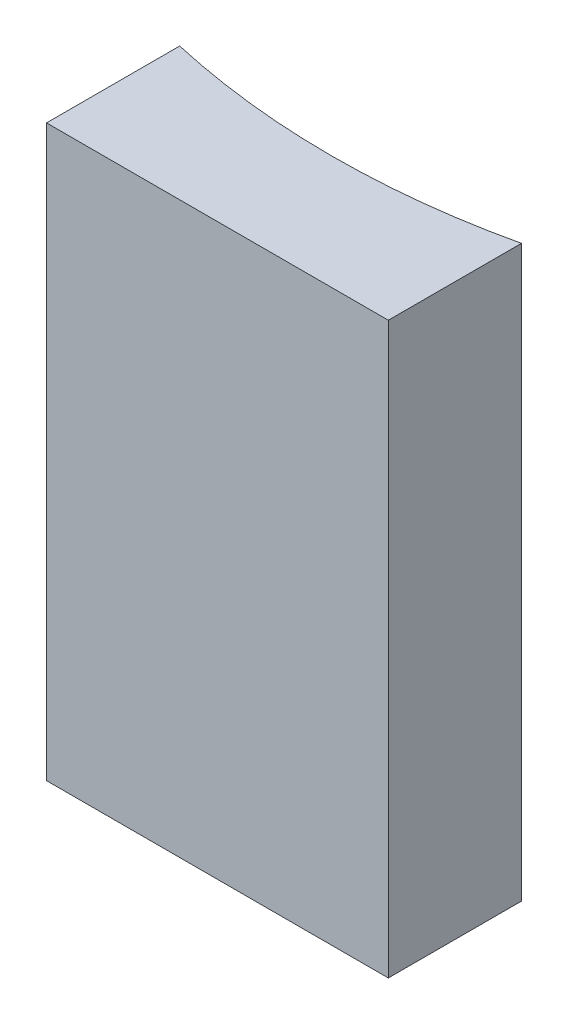
ISO-10303-21;
HEADER;
FILE_DESCRIPTION(('STEP AP214'),'2;1');
FILE_NAME('part.step','',(''),(''),'','','');
FILE_SCHEMA(('AUTOMOTIVE_DESIGN { 1 0 10303 214 1 1 1 1 }'));
ENDSEC;
DATA;
#1=APPLICATION_CONTEXT('core data for automotive mechanical design processes');
#2=APPLICATION_PROTOCOL_DEFINITION('international standard','automotive_design',2000,#1);
#3=PRODUCT_CONTEXT('',#1,'mechanical');
#4=PRODUCT('Part','Part','',(#3));
#5=PRODUCT_RELATED_PRODUCT_CATEGORY('part','',(#4));
#6=PRODUCT_DEFINITION_FORMATION('','',#4);
#7=PRODUCT_DEFINITION_CONTEXT('part definition',#1,'design');
#8=PRODUCT_DEFINITION('design','',#6,#7);
#9=PRODUCT_DEFINITION_SHAPE('','',#8);
#10=(LENGTH_UNIT() NAMED_UNIT(*) SI_UNIT(.MILLI.,.METRE.));
#11=(NAMED_UNIT(*) PLANE_ANGLE_UNIT() SI_UNIT($,.RADIAN.));
#12=(NAMED_UNIT(*) SI_UNIT($,.STERADIAN.) SOLID_ANGLE_UNIT());
#13=UNCERTAINTY_MEASURE_WITH_UNIT(LENGTH_MEASURE(1.E-05),#10,'distance_accuracy_value','');
#14=(GEOMETRIC_REPRESENTATION_CONTEXT(3) GLOBAL_UNCERTAINTY_ASSIGNED_CONTEXT((#13)) GLOBAL_UNIT_ASSIGNED_CONTEXT((#10,
#11,#12)) REPRESENTATION_CONTEXT('',''));
#15=CARTESIAN_POINT('',(0.,0.,0.));
#16=DIRECTION('',(0.,0.,1.));
#17=DIRECTION('',(1.,0.,0.));
#18=AXIS2_PLACEMENT_3D('',#15,#16,#17);
#19=CARTESIAN_POINT('',(0.,20.,5.));
#20=DIRECTION('',(0.,-1.,0.));
#21=DIRECTION('',(0.,0.,-1.));
#22=AXIS2_PLACEMENT_3D('',#19,#20,#21);
#23=PLANE('',#22);
#24=CARTESIAN_POINT('',(6.,20.,-26.));
#25=DIRECTION('',(0.,1.,0.));
#26=DIRECTION('',(0.,0.,1.));
#27=AXIS2_PLACEMENT_3D('',#24,#25,#26);
#28=CIRCLE('',#27,27.);
#29=CARTESIAN_POINT('',(0.,20.,0.324893162176369));
#30=VERTEX_POINT('',#29);
#31=CARTESIAN_POINT('',(12.,20.,0.324893162176369));
#32=VERTEX_POINT('',#31);
#33=EDGE_CURVE('E58',#30,#32,#28,.T.);
#34=ORIENTED_EDGE('',*,*,#33,.F.);
#35=DIRECTION('',(0.,0.,-1.));
#36=VECTOR('',#35,1.);
#37=CARTESIAN_POINT('',(0.,20.,5.));
#38=LINE('',#37,#36);
#39=CARTESIAN_POINT('',(0.,20.,5.));
#40=VERTEX_POINT('',#39);
#41=EDGE_CURVE('E98',#40,#30,#38,.T.);
#42=ORIENTED_EDGE('',*,*,#41,.F.);
#43=DIRECTION('',(-1.,0.,0.));
#44=VECTOR('',#43,1.);
#45=CARTESIAN_POINT('',(0.,20.,5.));
#46=LINE('',#45,#44);
#47=CARTESIAN_POINT('',(12.,20.,5.));
#48=VERTEX_POINT('',#47);
#49=EDGE_CURVE('E70',#48,#40,#46,.T.);
#50=ORIENTED_EDGE('',*,*,#49,.F.);
#51=DIRECTION('',(0.,0.,-1.));
#52=VECTOR('',#51,1.);
#53=CARTESIAN_POINT('',(12.,20.,5.));
#54=LINE('',#53,#52);
#55=EDGE_CURVE('E101',#48,#32,#54,.T.);
#56=ORIENTED_EDGE('',*,*,#55,.T.);
#57=EDGE_LOOP('',(#34,#42,#50,#56));
#58=FACE_BOUND('',#57,.T.);
#59=ADVANCED_FACE('F45',(#58),#23,.F.);
#60=CARTESIAN_POINT('',(0.,0.,5.));
#61=DIRECTION('',(1.,0.,0.));
#62=DIRECTION('',(0.,0.,-1.));
#63=AXIS2_PLACEMENT_3D('',#60,#61,#62);
#64=PLANE('',#63);
#65=ORIENTED_EDGE('',*,*,#41,.T.);
#66=DIRECTION('',(0.,1.,0.));
#67=VECTOR('',#66,1.);
#68=CARTESIAN_POINT('',(0.,-1.2E-05,0.324893162176366));
#69=LINE('',#68,#67);
#70=CARTESIAN_POINT('',(0.,0.,0.327410505857931));
#71=VERTEX_POINT('',#70);
#72=EDGE_CURVE('E82',#30,#71,#69,.F.);
#73=ORIENTED_EDGE('',*,*,#72,.T.);
#74=DIRECTION('',(0.,0.,-1.));
#75=VECTOR('',#74,1.);
#76=CARTESIAN_POINT('',(0.,0.,5.));
#77=LINE('',#76,#75);
#78=CARTESIAN_POINT('',(0.,0.,5.));
#79=VERTEX_POINT('',#78);
#80=EDGE_CURVE('E11',#79,#71,#77,.T.);
#81=ORIENTED_EDGE('',*,*,#80,.F.);
#82=DIRECTION('',(0.,-1.,0.));
#83=VECTOR('',#82,1.);
#84=CARTESIAN_POINT('',(0.,0.,5.));
#85=LINE('',#84,#83);
#86=EDGE_CURVE('E91',#40,#79,#85,.T.);
#87=ORIENTED_EDGE('',*,*,#86,.F.);
#88=EDGE_LOOP('',(#65,#73,#81,#87));
#89=FACE_BOUND('',#88,.T.);
#90=ADVANCED_FACE('F42',(#89),#64,.F.);
#91=CARTESIAN_POINT('',(0.,0.,5.));
#92=DIRECTION('',(0.,1.,0.));
#93=DIRECTION('',(0.,0.,1.));
#94=AXIS2_PLACEMENT_3D('',#91,#92,#93);
#95=PLANE('',#94);
#96=ORIENTED_EDGE('',*,*,#80,.T.);
#97=CARTESIAN_POINT('',(0.,0.,0.329927849539497));
#98=CARTESIAN_POINT('',(0.488756678047227,0.,0.44164556354679));
#99=CARTESIAN_POINT('',(0.980696331660701,0.,0.539370838699035));
#100=CARTESIAN_POINT('',(1.97013043439978,0.,0.706946291073603));
#101=CARTESIAN_POINT('',(2.46763264891994,0.,0.776750642919894));
#102=CARTESIAN_POINT('',(3.46818469844169,0.,0.888497982139847));
#103=CARTESIAN_POINT('',(3.97124972507361,0.,0.930304662561838));
#104=CARTESIAN_POINT('',(4.98286844886268,0.,0.986166422359195));
#105=CARTESIAN_POINT('',(5.49143421006725,0.,1.00000081781163));
#106=CARTESIAN_POINT('',(6.50861355861073,0.,0.999999182111561));
#107=CARTESIAN_POINT('',(7.01722714595503,0.,0.98616055180316));
#108=CARTESIAN_POINT('',(8.02886269255506,0.,0.930284343901475));
#109=CARTESIAN_POINT('',(8.53189695880908,0.,0.888471831625928));
#110=CARTESIAN_POINT('',(9.53240235879006,0.,0.776714065264571));
#111=CARTESIAN_POINT('',(10.0298885913423,0.,0.7069042629865));
#112=CARTESIAN_POINT('',(11.0193057255744,0.,0.539318752130493));
#113=CARTESIAN_POINT('',(11.5112442506744,0.,0.441588027871498));
#114=CARTESIAN_POINT('',(12.0000000014647,0.,0.329866767513899));
#115=B_SPLINE_CURVE_WITH_KNOTS('',3,(#97,#98,#99,#100,#101,#102,#103,#104,#105,#106,#107,#108,
#109,#110,#111,#112,#113,#114),.UNSPECIFIED.,.F.,.F.,(4,2,2,2,2,2,2,2,4),(0.,1.50386063620168,
3.01017946311019,4.52377951633115,6.04927505613039,7.57491388300602,9.08842339532741,
10.5946971676871,12.0985576876502),.UNSPECIFIED.);
#116=CARTESIAN_POINT('',(12.,0.,0.327379964845134));
#117=VERTEX_POINT('',#116);
#118=EDGE_CURVE('E86',#71,#117,#115,.T.);
#119=ORIENTED_EDGE('',*,*,#118,.T.);
#120=DIRECTION('',(0.,0.,-1.));
#121=VECTOR('',#120,1.);
#122=CARTESIAN_POINT('',(12.,0.,5.));
#123=LINE('',#122,#121);
#124=CARTESIAN_POINT('',(12.,0.,5.));
#125=VERTEX_POINT('',#124);
#126=EDGE_CURVE('E55',#125,#117,#123,.T.);
#127=ORIENTED_EDGE('',*,*,#126,.F.);
#128=DIRECTION('',(1.,0.,0.));
#129=VECTOR('',#128,1.);
#130=CARTESIAN_POINT('',(0.,0.,5.));
#131=LINE('',#130,#129);
#132=EDGE_CURVE('E118',#79,#125,#131,.T.);
#133=ORIENTED_EDGE('',*,*,#132,.F.);
#134=EDGE_LOOP('',(#96,#119,#127,#133));
#135=FACE_BOUND('',#134,.T.);
#136=ADVANCED_FACE('F117',(#135),#95,.F.);
#137=CARTESIAN_POINT('',(12.,0.,5.));
#138=DIRECTION('',(-1.,0.,0.));
#139=DIRECTION('',(0.,0.,1.));
#140=AXIS2_PLACEMENT_3D('',#137,#138,#139);
#141=PLANE('',#140);
#142=ORIENTED_EDGE('',*,*,#126,.T.);
#143=DIRECTION('',(0.,1.,0.));
#144=VECTOR('',#143,1.);
#145=CARTESIAN_POINT('',(12.,-1.2E-05,0.324893162176366));
#146=LINE('',#145,#144);
#147=EDGE_CURVE('E94',#117,#32,#146,.T.);
#148=ORIENTED_EDGE('',*,*,#147,.T.);
#149=ORIENTED_EDGE('',*,*,#55,.F.);
#150=DIRECTION('',(0.,1.,0.));
#151=VECTOR('',#150,1.);
#152=CARTESIAN_POINT('',(12.,0.,5.));
#153=LINE('',#152,#151);
#154=EDGE_CURVE('E104',#125,#48,#153,.T.);
#155=ORIENTED_EDGE('',*,*,#154,.F.);
#156=EDGE_LOOP('',(#142,#148,#149,#155));
#157=FACE_BOUND('',#156,.T.);
#158=ADVANCED_FACE('F116',(#157),#141,.F.);
#159=CARTESIAN_POINT('',(0.,0.,5.));
#160=DIRECTION('',(0.,0.,-1.));
#161=DIRECTION('',(-1.,0.,0.));
#162=AXIS2_PLACEMENT_3D('',#159,#160,#161);
#163=PLANE('',#162);
#164=ORIENTED_EDGE('',*,*,#86,.T.);
#165=ORIENTED_EDGE('',*,*,#132,.T.);
#166=ORIENTED_EDGE('',*,*,#154,.T.);
#167=ORIENTED_EDGE('',*,*,#49,.T.);
#168=EDGE_LOOP('',(#164,#165,#166,#167));
#169=FACE_BOUND('',#168,.T.);
#170=ADVANCED_FACE('F137',(#169),#163,.F.);
#171=CARTESIAN_POINT('',(6.,-1.2E-05,-26.));
#172=DIRECTION('',(0.,1.,0.));
#173=DIRECTION('',(0.,0.,1.));
#174=AXIS2_PLACEMENT_3D('',#171,#172,#173);
#175=CYLINDRICAL_SURFACE('',#174,27.);
#176=ORIENTED_EDGE('',*,*,#33,.T.);
#177=ORIENTED_EDGE('',*,*,#147,.F.);
#178=ORIENTED_EDGE('',*,*,#118,.F.);
#179=ORIENTED_EDGE('',*,*,#72,.F.);
#180=EDGE_LOOP('',(#176,#177,#178,#179));
#181=FACE_BOUND('',#180,.T.);
#182=ADVANCED_FACE('F88',(#181),#175,.F.);
#183=CLOSED_SHELL('',(#59,#90,#136,#158,#170,#182));
#184=MANIFOLD_SOLID_BREP('B2',#183);
#185=ADVANCED_BREP_SHAPE_REPRESENTATION('',(#18,#184),#14);
#186=SHAPE_DEFINITION_REPRESENTATION(#9,#185);
ENDSEC;
END-ISO-10303-21;
